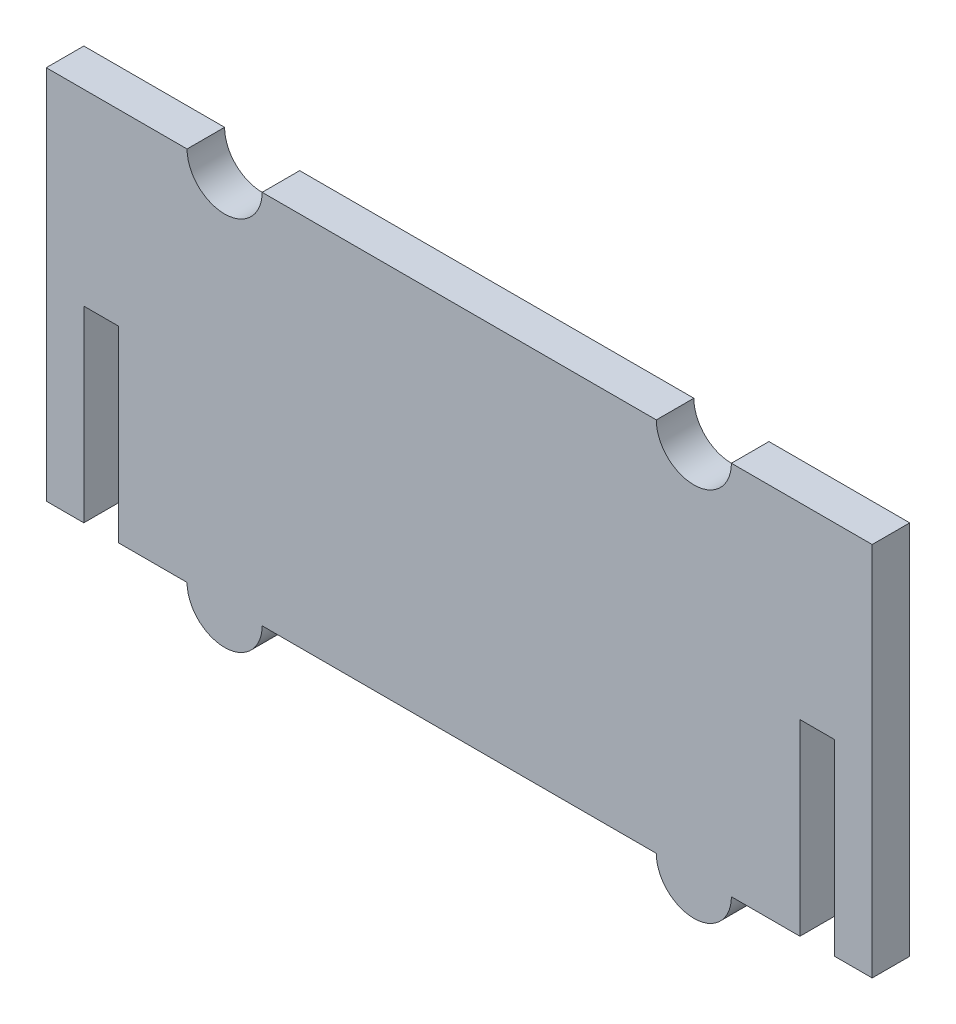
ISO-10303-21;
HEADER;
FILE_DESCRIPTION(('STEP AP214'),'2;1');
FILE_NAME('part.step','',(''),(''),'','','');
FILE_SCHEMA(('AUTOMOTIVE_DESIGN { 1 0 10303 214 1 1 1 1 }'));
ENDSEC;
DATA;
#1=APPLICATION_CONTEXT('core data for automotive mechanical design processes');
#2=APPLICATION_PROTOCOL_DEFINITION('international standard','automotive_design',2000,#1);
#3=PRODUCT_CONTEXT('',#1,'mechanical');
#4=PRODUCT('Part','Part','',(#3));
#5=PRODUCT_RELATED_PRODUCT_CATEGORY('part','',(#4));
#6=PRODUCT_DEFINITION_FORMATION('','',#4);
#7=PRODUCT_DEFINITION_CONTEXT('part definition',#1,'design');
#8=PRODUCT_DEFINITION('design','',#6,#7);
#9=PRODUCT_DEFINITION_SHAPE('','',#8);
#10=(LENGTH_UNIT() NAMED_UNIT(*) SI_UNIT(.MILLI.,.METRE.));
#11=(NAMED_UNIT(*) PLANE_ANGLE_UNIT() SI_UNIT($,.RADIAN.));
#12=(NAMED_UNIT(*) SI_UNIT($,.STERADIAN.) SOLID_ANGLE_UNIT());
#13=UNCERTAINTY_MEASURE_WITH_UNIT(LENGTH_MEASURE(1.E-05),#10,'distance_accuracy_value','');
#14=(GEOMETRIC_REPRESENTATION_CONTEXT(3) GLOBAL_UNCERTAINTY_ASSIGNED_CONTEXT((#13)) GLOBAL_UNIT_ASSIGNED_CONTEXT((#10,
#11,#12)) REPRESENTATION_CONTEXT('',''));
#15=CARTESIAN_POINT('',(0.,0.,0.));
#16=DIRECTION('',(0.,0.,1.));
#17=DIRECTION('',(1.,0.,0.));
#18=AXIS2_PLACEMENT_3D('',#15,#16,#17);
#19=CARTESIAN_POINT('',(0.,0.,4.));
#20=DIRECTION('',(1.,0.,0.));
#21=DIRECTION('',(0.,1.,0.));
#22=AXIS2_PLACEMENT_3D('',#19,#20,#21);
#23=PLANE('',#22);
#24=DIRECTION('',(0.,-1.,0.));
#25=VECTOR('',#24,1.);
#26=CARTESIAN_POINT('',(0.,0.,0.));
#27=LINE('',#26,#25);
#28=CARTESIAN_POINT('',(0.,40.,0.));
#29=VERTEX_POINT('',#28);
#30=CARTESIAN_POINT('',(0.,0.,0.));
#31=VERTEX_POINT('',#30);
#32=EDGE_CURVE('E199',#29,#31,#27,.T.);
#33=ORIENTED_EDGE('',*,*,#32,.T.);
#34=DIRECTION('',(0.,0.,-1.));
#35=VECTOR('',#34,1.);
#36=CARTESIAN_POINT('',(0.,0.,4.));
#37=LINE('',#36,#35);
#38=CARTESIAN_POINT('',(0.,0.,4.));
#39=VERTEX_POINT('',#38);
#40=EDGE_CURVE('E11',#39,#31,#37,.T.);
#41=ORIENTED_EDGE('',*,*,#40,.F.);
#42=DIRECTION('',(0.,-1.,0.));
#43=VECTOR('',#42,1.);
#44=CARTESIAN_POINT('',(0.,0.,4.));
#45=LINE('',#44,#43);
#46=CARTESIAN_POINT('',(0.,40.,4.));
#47=VERTEX_POINT('',#46);
#48=EDGE_CURVE('E237',#47,#39,#45,.T.);
#49=ORIENTED_EDGE('',*,*,#48,.F.);
#50=DIRECTION('',(0.,0.,-1.));
#51=VECTOR('',#50,1.);
#52=CARTESIAN_POINT('',(0.,40.,4.));
#53=LINE('',#52,#51);
#54=EDGE_CURVE('E195',#47,#29,#53,.T.);
#55=ORIENTED_EDGE('',*,*,#54,.T.);
#56=EDGE_LOOP('',(#33,#41,#49,#55));
#57=FACE_BOUND('',#56,.T.);
#58=ADVANCED_FACE('F31',(#57),#23,.F.);
#59=CARTESIAN_POINT('',(0.,0.,4.));
#60=DIRECTION('',(0.,1.,0.));
#61=DIRECTION('',(0.,0.,1.));
#62=AXIS2_PLACEMENT_3D('',#59,#60,#61);
#63=PLANE('',#62);
#64=DIRECTION('',(1.,0.,0.));
#65=VECTOR('',#64,1.);
#66=CARTESIAN_POINT('',(0.,0.,0.));
#67=LINE('',#66,#65);
#68=CARTESIAN_POINT('',(4.,0.,0.));
#69=VERTEX_POINT('',#68);
#70=EDGE_CURVE('E202',#31,#69,#67,.T.);
#71=ORIENTED_EDGE('',*,*,#70,.T.);
#72=DIRECTION('',(0.,0.,-1.));
#73=VECTOR('',#72,1.);
#74=CARTESIAN_POINT('',(4.,0.,4.));
#75=LINE('',#74,#73);
#76=CARTESIAN_POINT('',(4.,0.,4.));
#77=VERTEX_POINT('',#76);
#78=EDGE_CURVE('E39',#77,#69,#75,.T.);
#79=ORIENTED_EDGE('',*,*,#78,.F.);
#80=DIRECTION('',(1.,0.,0.));
#81=VECTOR('',#80,1.);
#82=CARTESIAN_POINT('',(0.,0.,4.));
#83=LINE('',#82,#81);
#84=EDGE_CURVE('E126',#39,#77,#83,.T.);
#85=ORIENTED_EDGE('',*,*,#84,.F.);
#86=ORIENTED_EDGE('',*,*,#40,.T.);
#87=EDGE_LOOP('',(#71,#79,#85,#86));
#88=FACE_BOUND('',#87,.T.);
#89=ADVANCED_FACE('F355',(#88),#63,.F.);
#90=CARTESIAN_POINT('',(4.,0.,4.));
#91=DIRECTION('',(-1.,0.,0.));
#92=DIRECTION('',(0.,0.,1.));
#93=AXIS2_PLACEMENT_3D('',#90,#91,#92);
#94=PLANE('',#93);
#95=DIRECTION('',(0.,1.,0.));
#96=VECTOR('',#95,1.);
#97=CARTESIAN_POINT('',(4.,0.,0.));
#98=LINE('',#97,#96);
#99=CARTESIAN_POINT('',(4.,20.,0.));
#100=VERTEX_POINT('',#99);
#101=EDGE_CURVE('E204',#69,#100,#98,.T.);
#102=ORIENTED_EDGE('',*,*,#101,.T.);
#103=DIRECTION('',(0.,0.,-1.));
#104=VECTOR('',#103,1.);
#105=CARTESIAN_POINT('',(4.,20.,4.));
#106=LINE('',#105,#104);
#107=CARTESIAN_POINT('',(4.,20.,4.));
#108=VERTEX_POINT('',#107);
#109=EDGE_CURVE('E280',#108,#100,#106,.T.);
#110=ORIENTED_EDGE('',*,*,#109,.F.);
#111=DIRECTION('',(0.,1.,0.));
#112=VECTOR('',#111,1.);
#113=CARTESIAN_POINT('',(4.,0.,4.));
#114=LINE('',#113,#112);
#115=EDGE_CURVE('E288',#77,#108,#114,.T.);
#116=ORIENTED_EDGE('',*,*,#115,.F.);
#117=ORIENTED_EDGE('',*,*,#78,.T.);
#118=EDGE_LOOP('',(#102,#110,#116,#117));
#119=FACE_BOUND('',#118,.T.);
#120=ADVANCED_FACE('F286',(#119),#94,.F.);
#121=CARTESIAN_POINT('',(4.,20.,4.));
#122=DIRECTION('',(0.,1.,0.));
#123=DIRECTION('',(0.,0.,1.));
#124=AXIS2_PLACEMENT_3D('',#121,#122,#123);
#125=PLANE('',#124);
#126=DIRECTION('',(1.,0.,0.));
#127=VECTOR('',#126,1.);
#128=CARTESIAN_POINT('',(4.,20.,0.));
#129=LINE('',#128,#127);
#130=CARTESIAN_POINT('',(7.7,20.,0.));
#131=VERTEX_POINT('',#130);
#132=EDGE_CURVE('E206',#100,#131,#129,.T.);
#133=ORIENTED_EDGE('',*,*,#132,.T.);
#134=DIRECTION('',(0.,0.,-1.));
#135=VECTOR('',#134,1.);
#136=CARTESIAN_POINT('',(7.7,20.,4.));
#137=LINE('',#136,#135);
#138=CARTESIAN_POINT('',(7.7,20.,4.));
#139=VERTEX_POINT('',#138);
#140=EDGE_CURVE('E277',#139,#131,#137,.T.);
#141=ORIENTED_EDGE('',*,*,#140,.F.);
#142=DIRECTION('',(1.,0.,0.));
#143=VECTOR('',#142,1.);
#144=CARTESIAN_POINT('',(4.,20.,4.));
#145=LINE('',#144,#143);
#146=EDGE_CURVE('E306',#108,#139,#145,.T.);
#147=ORIENTED_EDGE('',*,*,#146,.F.);
#148=ORIENTED_EDGE('',*,*,#109,.T.);
#149=EDGE_LOOP('',(#133,#141,#147,#148));
#150=FACE_BOUND('',#149,.T.);
#151=ADVANCED_FACE('F297',(#150),#125,.F.);
#152=CARTESIAN_POINT('',(7.7,0.,4.));
#153=DIRECTION('',(1.,0.,0.));
#154=DIRECTION('',(0.,0.,-1.));
#155=AXIS2_PLACEMENT_3D('',#152,#153,#154);
#156=PLANE('',#155);
#157=DIRECTION('',(0.,-1.,0.));
#158=VECTOR('',#157,1.);
#159=CARTESIAN_POINT('',(7.7,0.,0.));
#160=LINE('',#159,#158);
#161=CARTESIAN_POINT('',(7.7,0.,0.));
#162=VERTEX_POINT('',#161);
#163=EDGE_CURVE('E208',#131,#162,#160,.T.);
#164=ORIENTED_EDGE('',*,*,#163,.T.);
#165=DIRECTION('',(0.,0.,-1.));
#166=VECTOR('',#165,1.);
#167=CARTESIAN_POINT('',(7.7,0.,4.));
#168=LINE('',#167,#166);
#169=CARTESIAN_POINT('',(7.7,0.,4.));
#170=VERTEX_POINT('',#169);
#171=EDGE_CURVE('E274',#170,#162,#168,.T.);
#172=ORIENTED_EDGE('',*,*,#171,.F.);
#173=DIRECTION('',(0.,-1.,0.));
#174=VECTOR('',#173,1.);
#175=CARTESIAN_POINT('',(7.7,0.,4.));
#176=LINE('',#175,#174);
#177=EDGE_CURVE('E303',#139,#170,#176,.T.);
#178=ORIENTED_EDGE('',*,*,#177,.F.);
#179=ORIENTED_EDGE('',*,*,#140,.T.);
#180=EDGE_LOOP('',(#164,#172,#178,#179));
#181=FACE_BOUND('',#180,.T.);
#182=ADVANCED_FACE('F301',(#181),#156,.F.);
#183=CARTESIAN_POINT('',(7.7,0.,4.));
#184=DIRECTION('',(0.,1.,0.));
#185=DIRECTION('',(0.,0.,1.));
#186=AXIS2_PLACEMENT_3D('',#183,#184,#185);
#187=PLANE('',#186);
#188=DIRECTION('',(1.,0.,0.));
#189=VECTOR('',#188,1.);
#190=CARTESIAN_POINT('',(7.7,0.,0.));
#191=LINE('',#190,#189);
#192=CARTESIAN_POINT('',(15.,0.,0.));
#193=VERTEX_POINT('',#192);
#194=EDGE_CURVE('E210',#162,#193,#191,.T.);
#195=ORIENTED_EDGE('',*,*,#194,.T.);
#196=DIRECTION('',(0.,0.,-1.));
#197=VECTOR('',#196,1.);
#198=CARTESIAN_POINT('',(15.,0.,4.));
#199=LINE('',#198,#197);
#200=CARTESIAN_POINT('',(15.,0.,4.));
#201=VERTEX_POINT('',#200);
#202=EDGE_CURVE('E271',#201,#193,#199,.T.);
#203=ORIENTED_EDGE('',*,*,#202,.F.);
#204=DIRECTION('',(1.,0.,0.));
#205=VECTOR('',#204,1.);
#206=CARTESIAN_POINT('',(7.7,0.,4.));
#207=LINE('',#206,#205);
#208=EDGE_CURVE('E305',#170,#201,#207,.T.);
#209=ORIENTED_EDGE('',*,*,#208,.F.);
#210=ORIENTED_EDGE('',*,*,#171,.T.);
#211=EDGE_LOOP('',(#195,#203,#209,#210));
#212=FACE_BOUND('',#211,.T.);
#213=ADVANCED_FACE('F368',(#212),#187,.F.);
#214=CARTESIAN_POINT('',(19.,0.,4.));
#215=DIRECTION('',(0.,0.,-1.));
#216=DIRECTION('',(-1.,0.,0.));
#217=AXIS2_PLACEMENT_3D('',#214,#215,#216);
#218=CYLINDRICAL_SURFACE('',#217,4.);
#219=CARTESIAN_POINT('',(19.,0.,0.));
#220=DIRECTION('',(0.,0.,1.));
#221=DIRECTION('',(-1.,0.,0.));
#222=AXIS2_PLACEMENT_3D('',#219,#220,#221);
#223=CIRCLE('',#222,4.);
#224=CARTESIAN_POINT('',(23.,0.,0.));
#225=VERTEX_POINT('',#224);
#226=EDGE_CURVE('E212',#193,#225,#223,.T.);
#227=ORIENTED_EDGE('',*,*,#226,.T.);
#228=DIRECTION('',(0.,0.,-1.));
#229=VECTOR('',#228,1.);
#230=CARTESIAN_POINT('',(23.,0.,4.));
#231=LINE('',#230,#229);
#232=CARTESIAN_POINT('',(23.,0.,4.));
#233=VERTEX_POINT('',#232);
#234=EDGE_CURVE('E268',#233,#225,#231,.T.);
#235=ORIENTED_EDGE('',*,*,#234,.F.);
#236=CARTESIAN_POINT('',(19.,0.,4.));
#237=DIRECTION('',(0.,0.,1.));
#238=DIRECTION('',(-1.,0.,0.));
#239=AXIS2_PLACEMENT_3D('',#236,#237,#238);
#240=CIRCLE('',#239,4.);
#241=EDGE_CURVE('E308',#201,#233,#240,.T.);
#242=ORIENTED_EDGE('',*,*,#241,.F.);
#243=ORIENTED_EDGE('',*,*,#202,.T.);
#244=EDGE_LOOP('',(#227,#235,#242,#243));
#245=FACE_BOUND('',#244,.T.);
#246=ADVANCED_FACE('F371',(#245),#218,.T.);
#247=CARTESIAN_POINT('',(23.,0.,4.));
#248=DIRECTION('',(0.,1.,0.));
#249=DIRECTION('',(0.,0.,1.));
#250=AXIS2_PLACEMENT_3D('',#247,#248,#249);
#251=PLANE('',#250);
#252=DIRECTION('',(1.,0.,0.));
#253=VECTOR('',#252,1.);
#254=CARTESIAN_POINT('',(23.,0.,0.));
#255=LINE('',#254,#253);
#256=CARTESIAN_POINT('',(65.,0.,0.));
#257=VERTEX_POINT('',#256);
#258=EDGE_CURVE('E214',#225,#257,#255,.T.);
#259=ORIENTED_EDGE('',*,*,#258,.T.);
#260=DIRECTION('',(0.,0.,-1.));
#261=VECTOR('',#260,1.);
#262=CARTESIAN_POINT('',(65.,0.,4.));
#263=LINE('',#262,#261);
#264=CARTESIAN_POINT('',(65.,0.,4.));
#265=VERTEX_POINT('',#264);
#266=EDGE_CURVE('E265',#265,#257,#263,.T.);
#267=ORIENTED_EDGE('',*,*,#266,.F.);
#268=DIRECTION('',(1.,0.,0.));
#269=VECTOR('',#268,1.);
#270=CARTESIAN_POINT('',(23.,0.,4.));
#271=LINE('',#270,#269);
#272=EDGE_CURVE('E314',#233,#265,#271,.T.);
#273=ORIENTED_EDGE('',*,*,#272,.F.);
#274=ORIENTED_EDGE('',*,*,#234,.T.);
#275=EDGE_LOOP('',(#259,#267,#273,#274));
#276=FACE_BOUND('',#275,.T.);
#277=ADVANCED_FACE('F375',(#276),#251,.F.);
#278=CARTESIAN_POINT('',(69.,0.,4.));
#279=DIRECTION('',(0.,0.,-1.));
#280=DIRECTION('',(-1.,0.,0.));
#281=AXIS2_PLACEMENT_3D('',#278,#279,#280);
#282=CYLINDRICAL_SURFACE('',#281,4.);
#283=CARTESIAN_POINT('',(69.,0.,0.));
#284=DIRECTION('',(0.,0.,1.));
#285=DIRECTION('',(1.,0.,0.));
#286=AXIS2_PLACEMENT_3D('',#283,#284,#285);
#287=CIRCLE('',#286,4.);
#288=CARTESIAN_POINT('',(73.,0.,0.));
#289=VERTEX_POINT('',#288);
#290=EDGE_CURVE('E216',#257,#289,#287,.T.);
#291=ORIENTED_EDGE('',*,*,#290,.T.);
#292=DIRECTION('',(0.,0.,-1.));
#293=VECTOR('',#292,1.);
#294=CARTESIAN_POINT('',(73.,0.,4.));
#295=LINE('',#294,#293);
#296=CARTESIAN_POINT('',(73.,0.,4.));
#297=VERTEX_POINT('',#296);
#298=EDGE_CURVE('E262',#297,#289,#295,.T.);
#299=ORIENTED_EDGE('',*,*,#298,.F.);
#300=CARTESIAN_POINT('',(69.,0.,4.));
#301=DIRECTION('',(0.,0.,1.));
#302=DIRECTION('',(1.,0.,0.));
#303=AXIS2_PLACEMENT_3D('',#300,#301,#302);
#304=CIRCLE('',#303,4.);
#305=EDGE_CURVE('E316',#265,#297,#304,.T.);
#306=ORIENTED_EDGE('',*,*,#305,.F.);
#307=ORIENTED_EDGE('',*,*,#266,.T.);
#308=EDGE_LOOP('',(#291,#299,#306,#307));
#309=FACE_BOUND('',#308,.T.);
#310=ADVANCED_FACE('F379',(#309),#282,.T.);
#311=CARTESIAN_POINT('',(73.,0.,4.));
#312=DIRECTION('',(0.,1.,0.));
#313=DIRECTION('',(-1.,0.,0.));
#314=AXIS2_PLACEMENT_3D('',#311,#312,#313);
#315=PLANE('',#314);
#316=DIRECTION('',(1.,0.,0.));
#317=VECTOR('',#316,1.);
#318=CARTESIAN_POINT('',(73.,0.,0.));
#319=LINE('',#318,#317);
#320=CARTESIAN_POINT('',(80.3,0.,0.));
#321=VERTEX_POINT('',#320);
#322=EDGE_CURVE('E218',#289,#321,#319,.T.);
#323=ORIENTED_EDGE('',*,*,#322,.T.);
#324=DIRECTION('',(0.,0.,-1.));
#325=VECTOR('',#324,1.);
#326=CARTESIAN_POINT('',(80.3,0.,4.));
#327=LINE('',#326,#325);
#328=CARTESIAN_POINT('',(80.3,0.,4.));
#329=VERTEX_POINT('',#328);
#330=EDGE_CURVE('E259',#329,#321,#327,.T.);
#331=ORIENTED_EDGE('',*,*,#330,.F.);
#332=DIRECTION('',(1.,0.,0.));
#333=VECTOR('',#332,1.);
#334=CARTESIAN_POINT('',(73.,0.,4.));
#335=LINE('',#334,#333);
#336=EDGE_CURVE('E318',#297,#329,#335,.T.);
#337=ORIENTED_EDGE('',*,*,#336,.F.);
#338=ORIENTED_EDGE('',*,*,#298,.T.);
#339=EDGE_LOOP('',(#323,#331,#337,#338));
#340=FACE_BOUND('',#339,.T.);
#341=ADVANCED_FACE('F383',(#340),#315,.F.);
#342=CARTESIAN_POINT('',(80.3,0.,4.));
#343=DIRECTION('',(-1.,0.,0.));
#344=DIRECTION('',(0.,-1.,0.));
#345=AXIS2_PLACEMENT_3D('',#342,#343,#344);
#346=PLANE('',#345);
#347=DIRECTION('',(0.,1.,0.));
#348=VECTOR('',#347,1.);
#349=CARTESIAN_POINT('',(80.3,0.,0.));
#350=LINE('',#349,#348);
#351=CARTESIAN_POINT('',(80.3,20.,0.));
#352=VERTEX_POINT('',#351);
#353=EDGE_CURVE('E220',#321,#352,#350,.T.);
#354=ORIENTED_EDGE('',*,*,#353,.T.);
#355=DIRECTION('',(0.,0.,-1.));
#356=VECTOR('',#355,1.);
#357=CARTESIAN_POINT('',(80.3,20.,4.));
#358=LINE('',#357,#356);
#359=CARTESIAN_POINT('',(80.3,20.,4.));
#360=VERTEX_POINT('',#359);
#361=EDGE_CURVE('E256',#360,#352,#358,.T.);
#362=ORIENTED_EDGE('',*,*,#361,.F.);
#363=DIRECTION('',(0.,1.,0.));
#364=VECTOR('',#363,1.);
#365=CARTESIAN_POINT('',(80.3,0.,4.));
#366=LINE('',#365,#364);
#367=EDGE_CURVE('E320',#329,#360,#366,.T.);
#368=ORIENTED_EDGE('',*,*,#367,.F.);
#369=ORIENTED_EDGE('',*,*,#330,.T.);
#370=EDGE_LOOP('',(#354,#362,#368,#369));
#371=FACE_BOUND('',#370,.T.);
#372=ADVANCED_FACE('F387',(#371),#346,.F.);
#373=CARTESIAN_POINT('',(84.,20.,4.));
#374=DIRECTION('',(0.,1.,0.));
#375=DIRECTION('',(0.,0.,1.));
#376=AXIS2_PLACEMENT_3D('',#373,#374,#375);
#377=PLANE('',#376);
#378=DIRECTION('',(1.,0.,0.));
#379=VECTOR('',#378,1.);
#380=CARTESIAN_POINT('',(84.,20.,0.));
#381=LINE('',#380,#379);
#382=CARTESIAN_POINT('',(84.,20.,0.));
#383=VERTEX_POINT('',#382);
#384=EDGE_CURVE('E222',#352,#383,#381,.T.);
#385=ORIENTED_EDGE('',*,*,#384,.T.);
#386=DIRECTION('',(0.,0.,-1.));
#387=VECTOR('',#386,1.);
#388=CARTESIAN_POINT('',(84.,20.,4.));
#389=LINE('',#388,#387);
#390=CARTESIAN_POINT('',(84.,20.,4.));
#391=VERTEX_POINT('',#390);
#392=EDGE_CURVE('E253',#391,#383,#389,.T.);
#393=ORIENTED_EDGE('',*,*,#392,.F.);
#394=DIRECTION('',(1.,0.,0.));
#395=VECTOR('',#394,1.);
#396=CARTESIAN_POINT('',(84.,20.,4.));
#397=LINE('',#396,#395);
#398=EDGE_CURVE('E322',#360,#391,#397,.T.);
#399=ORIENTED_EDGE('',*,*,#398,.F.);
#400=ORIENTED_EDGE('',*,*,#361,.T.);
#401=EDGE_LOOP('',(#385,#393,#399,#400));
#402=FACE_BOUND('',#401,.T.);
#403=ADVANCED_FACE('F391',(#402),#377,.F.);
#404=CARTESIAN_POINT('',(84.,0.,4.));
#405=DIRECTION('',(1.,0.,0.));
#406=DIRECTION('',(0.,1.,0.));
#407=AXIS2_PLACEMENT_3D('',#404,#405,#406);
#408=PLANE('',#407);
#409=DIRECTION('',(0.,-1.,0.));
#410=VECTOR('',#409,1.);
#411=CARTESIAN_POINT('',(84.,0.,0.));
#412=LINE('',#411,#410);
#413=CARTESIAN_POINT('',(84.,0.,0.));
#414=VERTEX_POINT('',#413);
#415=EDGE_CURVE('E224',#383,#414,#412,.T.);
#416=ORIENTED_EDGE('',*,*,#415,.T.);
#417=DIRECTION('',(0.,0.,-1.));
#418=VECTOR('',#417,1.);
#419=CARTESIAN_POINT('',(84.,0.,4.));
#420=LINE('',#419,#418);
#421=CARTESIAN_POINT('',(84.,0.,4.));
#422=VERTEX_POINT('',#421);
#423=EDGE_CURVE('E250',#422,#414,#420,.T.);
#424=ORIENTED_EDGE('',*,*,#423,.F.);
#425=DIRECTION('',(0.,-1.,0.));
#426=VECTOR('',#425,1.);
#427=CARTESIAN_POINT('',(84.,0.,4.));
#428=LINE('',#427,#426);
#429=EDGE_CURVE('E324',#391,#422,#428,.T.);
#430=ORIENTED_EDGE('',*,*,#429,.F.);
#431=ORIENTED_EDGE('',*,*,#392,.T.);
#432=EDGE_LOOP('',(#416,#424,#430,#431));
#433=FACE_BOUND('',#432,.T.);
#434=ADVANCED_FACE('F395',(#433),#408,.F.);
#435=CARTESIAN_POINT('',(84.,0.,4.));
#436=DIRECTION('',(0.,1.,0.));
#437=DIRECTION('',(0.,0.,1.));
#438=AXIS2_PLACEMENT_3D('',#435,#436,#437);
#439=PLANE('',#438);
#440=DIRECTION('',(1.,0.,0.));
#441=VECTOR('',#440,1.);
#442=CARTESIAN_POINT('',(84.,0.,0.));
#443=LINE('',#442,#441);
#444=CARTESIAN_POINT('',(88.,0.,0.));
#445=VERTEX_POINT('',#444);
#446=EDGE_CURVE('E226',#414,#445,#443,.T.);
#447=ORIENTED_EDGE('',*,*,#446,.T.);
#448=DIRECTION('',(0.,0.,-1.));
#449=VECTOR('',#448,1.);
#450=CARTESIAN_POINT('',(88.,0.,4.));
#451=LINE('',#450,#449);
#452=CARTESIAN_POINT('',(88.,0.,4.));
#453=VERTEX_POINT('',#452);
#454=EDGE_CURVE('E247',#453,#445,#451,.T.);
#455=ORIENTED_EDGE('',*,*,#454,.F.);
#456=DIRECTION('',(1.,0.,0.));
#457=VECTOR('',#456,1.);
#458=CARTESIAN_POINT('',(84.,0.,4.));
#459=LINE('',#458,#457);
#460=EDGE_CURVE('E326',#422,#453,#459,.T.);
#461=ORIENTED_EDGE('',*,*,#460,.F.);
#462=ORIENTED_EDGE('',*,*,#423,.T.);
#463=EDGE_LOOP('',(#447,#455,#461,#462));
#464=FACE_BOUND('',#463,.T.);
#465=ADVANCED_FACE('F399',(#464),#439,.F.);
#466=CARTESIAN_POINT('',(88.,0.,4.));
#467=DIRECTION('',(-1.,0.,0.));
#468=DIRECTION('',(0.,-1.,0.));
#469=AXIS2_PLACEMENT_3D('',#466,#467,#468);
#470=PLANE('',#469);
#471=DIRECTION('',(0.,1.,0.));
#472=VECTOR('',#471,1.);
#473=CARTESIAN_POINT('',(88.,0.,0.));
#474=LINE('',#473,#472);
#475=CARTESIAN_POINT('',(88.,40.,0.));
#476=VERTEX_POINT('',#475);
#477=EDGE_CURVE('E228',#445,#476,#474,.T.);
#478=ORIENTED_EDGE('',*,*,#477,.T.);
#479=DIRECTION('',(0.,0.,-1.));
#480=VECTOR('',#479,1.);
#481=CARTESIAN_POINT('',(88.,40.,4.));
#482=LINE('',#481,#480);
#483=CARTESIAN_POINT('',(88.,40.,4.));
#484=VERTEX_POINT('',#483);
#485=EDGE_CURVE('E244',#484,#476,#482,.T.);
#486=ORIENTED_EDGE('',*,*,#485,.F.);
#487=DIRECTION('',(0.,1.,0.));
#488=VECTOR('',#487,1.);
#489=CARTESIAN_POINT('',(88.,0.,4.));
#490=LINE('',#489,#488);
#491=EDGE_CURVE('E328',#453,#484,#490,.T.);
#492=ORIENTED_EDGE('',*,*,#491,.F.);
#493=ORIENTED_EDGE('',*,*,#454,.T.);
#494=EDGE_LOOP('',(#478,#486,#492,#493));
#495=FACE_BOUND('',#494,.T.);
#496=ADVANCED_FACE('F403',(#495),#470,.F.);
#497=CARTESIAN_POINT('',(73.,40.,4.));
#498=DIRECTION('',(0.,-1.,0.));
#499=DIRECTION('',(1.,0.,0.));
#500=AXIS2_PLACEMENT_3D('',#497,#498,#499);
#501=PLANE('',#500);
#502=DIRECTION('',(-1.,0.,0.));
#503=VECTOR('',#502,1.);
#504=CARTESIAN_POINT('',(73.,40.,0.));
#505=LINE('',#504,#503);
#506=CARTESIAN_POINT('',(73.,40.,0.));
#507=VERTEX_POINT('',#506);
#508=EDGE_CURVE('E230',#476,#507,#505,.T.);
#509=ORIENTED_EDGE('',*,*,#508,.T.);
#510=DIRECTION('',(0.,0.,-1.));
#511=VECTOR('',#510,1.);
#512=CARTESIAN_POINT('',(73.,40.,4.));
#513=LINE('',#512,#511);
#514=CARTESIAN_POINT('',(73.,40.,4.));
#515=VERTEX_POINT('',#514);
#516=EDGE_CURVE('E241',#515,#507,#513,.T.);
#517=ORIENTED_EDGE('',*,*,#516,.F.);
#518=DIRECTION('',(-1.,0.,0.));
#519=VECTOR('',#518,1.);
#520=CARTESIAN_POINT('',(73.,40.,4.));
#521=LINE('',#520,#519);
#522=EDGE_CURVE('E330',#484,#515,#521,.T.);
#523=ORIENTED_EDGE('',*,*,#522,.F.);
#524=ORIENTED_EDGE('',*,*,#485,.T.);
#525=EDGE_LOOP('',(#509,#517,#523,#524));
#526=FACE_BOUND('',#525,.T.);
#527=ADVANCED_FACE('F336',(#526),#501,.F.);
#528=CARTESIAN_POINT('',(69.,40.,4.));
#529=DIRECTION('',(0.,0.,-1.));
#530=DIRECTION('',(-1.,0.,0.));
#531=AXIS2_PLACEMENT_3D('',#528,#529,#530);
#532=CYLINDRICAL_SURFACE('',#531,4.);
#533=CARTESIAN_POINT('',(69.,40.,0.));
#534=DIRECTION('',(0.,0.,-1.));
#535=DIRECTION('',(1.,0.,0.));
#536=AXIS2_PLACEMENT_3D('',#533,#534,#535);
#537=CIRCLE('',#536,4.);
#538=CARTESIAN_POINT('',(65.,40.,0.));
#539=VERTEX_POINT('',#538);
#540=EDGE_CURVE('E232',#507,#539,#537,.T.);
#541=ORIENTED_EDGE('',*,*,#540,.T.);
#542=DIRECTION('',(0.,0.,-1.));
#543=VECTOR('',#542,1.);
#544=CARTESIAN_POINT('',(65.,40.,4.));
#545=LINE('',#544,#543);
#546=CARTESIAN_POINT('',(65.,40.,4.));
#547=VERTEX_POINT('',#546);
#548=EDGE_CURVE('E190',#547,#539,#545,.T.);
#549=ORIENTED_EDGE('',*,*,#548,.F.);
#550=CARTESIAN_POINT('',(69.,40.,4.));
#551=DIRECTION('',(0.,0.,-1.));
#552=DIRECTION('',(1.,0.,0.));
#553=AXIS2_PLACEMENT_3D('',#550,#551,#552);
#554=CIRCLE('',#553,4.);
#555=EDGE_CURVE('E181',#515,#547,#554,.T.);
#556=ORIENTED_EDGE('',*,*,#555,.F.);
#557=ORIENTED_EDGE('',*,*,#516,.T.);
#558=EDGE_LOOP('',(#541,#549,#556,#557));
#559=FACE_BOUND('',#558,.T.);
#560=ADVANCED_FACE('F340',(#559),#532,.F.);
#561=CARTESIAN_POINT('',(23.,40.,4.));
#562=DIRECTION('',(0.,-1.,0.));
#563=DIRECTION('',(1.,0.,0.));
#564=AXIS2_PLACEMENT_3D('',#561,#562,#563);
#565=PLANE('',#564);
#566=DIRECTION('',(-1.,0.,0.));
#567=VECTOR('',#566,1.);
#568=CARTESIAN_POINT('',(23.,40.,0.));
#569=LINE('',#568,#567);
#570=CARTESIAN_POINT('',(23.,40.,0.));
#571=VERTEX_POINT('',#570);
#572=EDGE_CURVE('E189',#539,#571,#569,.T.);
#573=ORIENTED_EDGE('',*,*,#572,.T.);
#574=DIRECTION('',(0.,0.,-1.));
#575=VECTOR('',#574,1.);
#576=CARTESIAN_POINT('',(23.,40.,4.));
#577=LINE('',#576,#575);
#578=CARTESIAN_POINT('',(23.,40.,4.));
#579=VERTEX_POINT('',#578);
#580=EDGE_CURVE('E186',#579,#571,#577,.T.);
#581=ORIENTED_EDGE('',*,*,#580,.F.);
#582=DIRECTION('',(-1.,0.,0.));
#583=VECTOR('',#582,1.);
#584=CARTESIAN_POINT('',(23.,40.,4.));
#585=LINE('',#584,#583);
#586=EDGE_CURVE('E175',#547,#579,#585,.T.);
#587=ORIENTED_EDGE('',*,*,#586,.F.);
#588=ORIENTED_EDGE('',*,*,#548,.T.);
#589=EDGE_LOOP('',(#573,#581,#587,#588));
#590=FACE_BOUND('',#589,.T.);
#591=ADVANCED_FACE('F187',(#590),#565,.F.);
#592=CARTESIAN_POINT('',(19.,40.,4.));
#593=DIRECTION('',(0.,0.,-1.));
#594=DIRECTION('',(-1.,0.,0.));
#595=AXIS2_PLACEMENT_3D('',#592,#593,#594);
#596=CYLINDRICAL_SURFACE('',#595,4.);
#597=CARTESIAN_POINT('',(19.,40.,0.));
#598=DIRECTION('',(0.,0.,-1.));
#599=DIRECTION('',(-1.,0.,0.));
#600=AXIS2_PLACEMENT_3D('',#597,#598,#599);
#601=CIRCLE('',#600,4.);
#602=CARTESIAN_POINT('',(15.,40.,0.));
#603=VERTEX_POINT('',#602);
#604=EDGE_CURVE('E112',#571,#603,#601,.T.);
#605=ORIENTED_EDGE('',*,*,#604,.T.);
#606=DIRECTION('',(0.,0.,-1.));
#607=VECTOR('',#606,1.);
#608=CARTESIAN_POINT('',(15.,40.,4.));
#609=LINE('',#608,#607);
#610=CARTESIAN_POINT('',(15.,40.,4.));
#611=VERTEX_POINT('',#610);
#612=EDGE_CURVE('E191',#611,#603,#609,.T.);
#613=ORIENTED_EDGE('',*,*,#612,.F.);
#614=CARTESIAN_POINT('',(19.,40.,4.));
#615=DIRECTION('',(0.,0.,-1.));
#616=DIRECTION('',(-1.,0.,0.));
#617=AXIS2_PLACEMENT_3D('',#614,#615,#616);
#618=CIRCLE('',#617,4.);
#619=EDGE_CURVE('E179',#579,#611,#618,.T.);
#620=ORIENTED_EDGE('',*,*,#619,.F.);
#621=ORIENTED_EDGE('',*,*,#580,.T.);
#622=EDGE_LOOP('',(#605,#613,#620,#621));
#623=FACE_BOUND('',#622,.T.);
#624=ADVANCED_FACE('F193',(#623),#596,.F.);
#625=CARTESIAN_POINT('',(0.,40.,4.));
#626=DIRECTION('',(0.,-1.,0.));
#627=DIRECTION('',(0.,0.,-1.));
#628=AXIS2_PLACEMENT_3D('',#625,#626,#627);
#629=PLANE('',#628);
#630=DIRECTION('',(-1.,0.,0.));
#631=VECTOR('',#630,1.);
#632=CARTESIAN_POINT('',(0.,40.,0.));
#633=LINE('',#632,#631);
#634=EDGE_CURVE('E118',#603,#29,#633,.T.);
#635=ORIENTED_EDGE('',*,*,#634,.T.);
#636=ORIENTED_EDGE('',*,*,#54,.F.);
#637=DIRECTION('',(-1.,0.,0.));
#638=VECTOR('',#637,1.);
#639=CARTESIAN_POINT('',(0.,40.,4.));
#640=LINE('',#639,#638);
#641=EDGE_CURVE('E47',#611,#47,#640,.T.);
#642=ORIENTED_EDGE('',*,*,#641,.F.);
#643=ORIENTED_EDGE('',*,*,#612,.T.);
#644=EDGE_LOOP('',(#635,#636,#642,#643));
#645=FACE_BOUND('',#644,.T.);
#646=ADVANCED_FACE('F344',(#645),#629,.F.);
#647=CARTESIAN_POINT('',(19.,40.,4.));
#648=DIRECTION('',(0.,0.,-1.));
#649=DIRECTION('',(-1.,0.,0.));
#650=AXIS2_PLACEMENT_3D('',#647,#648,#649);
#651=PLANE('',#650);
#652=ORIENTED_EDGE('',*,*,#48,.T.);
#653=ORIENTED_EDGE('',*,*,#84,.T.);
#654=ORIENTED_EDGE('',*,*,#115,.T.);
#655=ORIENTED_EDGE('',*,*,#146,.T.);
#656=ORIENTED_EDGE('',*,*,#177,.T.);
#657=ORIENTED_EDGE('',*,*,#208,.T.);
#658=ORIENTED_EDGE('',*,*,#241,.T.);
#659=ORIENTED_EDGE('',*,*,#272,.T.);
#660=ORIENTED_EDGE('',*,*,#305,.T.);
#661=ORIENTED_EDGE('',*,*,#336,.T.);
#662=ORIENTED_EDGE('',*,*,#367,.T.);
#663=ORIENTED_EDGE('',*,*,#398,.T.);
#664=ORIENTED_EDGE('',*,*,#429,.T.);
#665=ORIENTED_EDGE('',*,*,#460,.T.);
#666=ORIENTED_EDGE('',*,*,#491,.T.);
#667=ORIENTED_EDGE('',*,*,#522,.T.);
#668=ORIENTED_EDGE('',*,*,#555,.T.);
#669=ORIENTED_EDGE('',*,*,#586,.T.);
#670=ORIENTED_EDGE('',*,*,#619,.T.);
#671=ORIENTED_EDGE('',*,*,#641,.T.);
#672=EDGE_LOOP('',(#652,#653,#654,#655,#656,#657,#658,#659,#660,#661,#662,#663,#664,#665,#666,
#667,#668,#669,#670,#671));
#673=FACE_BOUND('',#672,.T.);
#674=ADVANCED_FACE('F177',(#673),#651,.F.);
#675=CARTESIAN_POINT('',(19.,40.,0.));
#676=DIRECTION('',(0.,0.,-1.));
#677=DIRECTION('',(-1.,0.,0.));
#678=AXIS2_PLACEMENT_3D('',#675,#676,#677);
#679=PLANE('',#678);
#680=ORIENTED_EDGE('',*,*,#32,.F.);
#681=ORIENTED_EDGE('',*,*,#634,.F.);
#682=ORIENTED_EDGE('',*,*,#604,.F.);
#683=ORIENTED_EDGE('',*,*,#572,.F.);
#684=ORIENTED_EDGE('',*,*,#540,.F.);
#685=ORIENTED_EDGE('',*,*,#508,.F.);
#686=ORIENTED_EDGE('',*,*,#477,.F.);
#687=ORIENTED_EDGE('',*,*,#446,.F.);
#688=ORIENTED_EDGE('',*,*,#415,.F.);
#689=ORIENTED_EDGE('',*,*,#384,.F.);
#690=ORIENTED_EDGE('',*,*,#353,.F.);
#691=ORIENTED_EDGE('',*,*,#322,.F.);
#692=ORIENTED_EDGE('',*,*,#290,.F.);
#693=ORIENTED_EDGE('',*,*,#258,.F.);
#694=ORIENTED_EDGE('',*,*,#226,.F.);
#695=ORIENTED_EDGE('',*,*,#194,.F.);
#696=ORIENTED_EDGE('',*,*,#163,.F.);
#697=ORIENTED_EDGE('',*,*,#132,.F.);
#698=ORIENTED_EDGE('',*,*,#101,.F.);
#699=ORIENTED_EDGE('',*,*,#70,.F.);
#700=EDGE_LOOP('',(#680,#681,#682,#683,#684,#685,#686,#687,#688,#689,#690,#691,#692,#693,#694,
#695,#696,#697,#698,#699));
#701=FACE_BOUND('',#700,.T.);
#702=ADVANCED_FACE('F292',(#701),#679,.T.);
#703=CLOSED_SHELL('',(#58,#89,#120,#151,#182,#213,#246,#277,#310,#341,#372,#403,#434,#465,#496,
#527,#560,#591,#624,#646,#674,#702));
#704=MANIFOLD_SOLID_BREP('B2',#703);
#705=ADVANCED_BREP_SHAPE_REPRESENTATION('',(#18,#704),#14);
#706=SHAPE_DEFINITION_REPRESENTATION(#9,#705);
ENDSEC;
END-ISO-10303-21;
